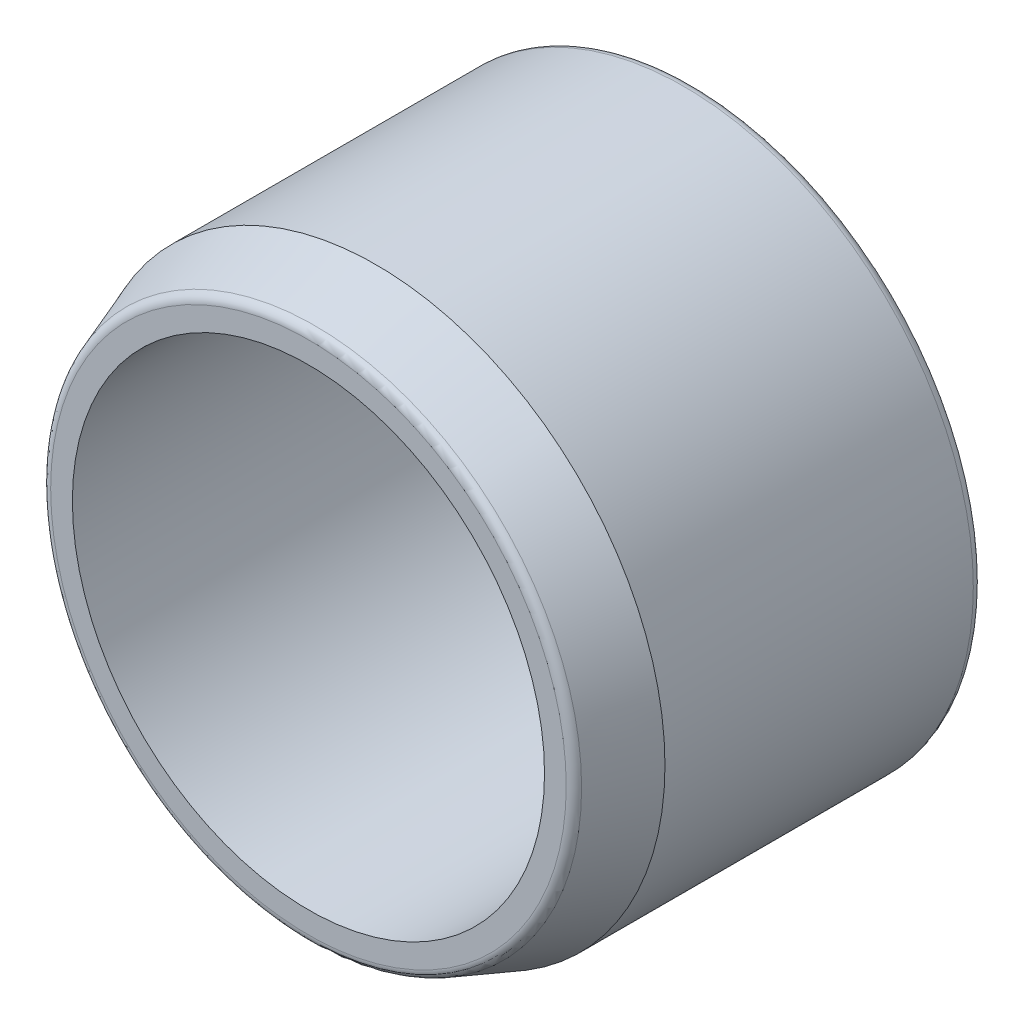
ISO-10303-21;
HEADER;
FILE_DESCRIPTION(('STEP AP214'),'2;1');
FILE_NAME('part.step','',(''),(''),'','','');
FILE_SCHEMA(('AUTOMOTIVE_DESIGN { 1 0 10303 214 1 1 1 1 }'));
ENDSEC;
DATA;
#1=APPLICATION_CONTEXT('core data for automotive mechanical design processes');
#2=APPLICATION_PROTOCOL_DEFINITION('international standard','automotive_design',2000,#1);
#3=PRODUCT_CONTEXT('',#1,'mechanical');
#4=PRODUCT('Part','Part','',(#3));
#5=PRODUCT_RELATED_PRODUCT_CATEGORY('part','',(#4));
#6=PRODUCT_DEFINITION_FORMATION('','',#4);
#7=PRODUCT_DEFINITION_CONTEXT('part definition',#1,'design');
#8=PRODUCT_DEFINITION('design','',#6,#7);
#9=PRODUCT_DEFINITION_SHAPE('','',#8);
#10=(LENGTH_UNIT() NAMED_UNIT(*) SI_UNIT(.MILLI.,.METRE.));
#11=(NAMED_UNIT(*) PLANE_ANGLE_UNIT() SI_UNIT($,.RADIAN.));
#12=(NAMED_UNIT(*) SI_UNIT($,.STERADIAN.) SOLID_ANGLE_UNIT());
#13=UNCERTAINTY_MEASURE_WITH_UNIT(LENGTH_MEASURE(1.E-05),#10,'distance_accuracy_value','');
#14=(GEOMETRIC_REPRESENTATION_CONTEXT(3) GLOBAL_UNCERTAINTY_ASSIGNED_CONTEXT((#13)) GLOBAL_UNIT_ASSIGNED_CONTEXT((#10,
#11,#12)) REPRESENTATION_CONTEXT('',''));
#15=CARTESIAN_POINT('',(0.,0.,0.));
#16=DIRECTION('',(0.,0.,1.));
#17=DIRECTION('',(1.,0.,0.));
#18=AXIS2_PLACEMENT_3D('',#15,#16,#17);
#19=CARTESIAN_POINT('',(0.,0.,40.));
#20=DIRECTION('',(0.,0.,1.));
#21=DIRECTION('',(1.,0.,0.));
#22=AXIS2_PLACEMENT_3D('',#19,#20,#21);
#23=PLANE('',#22);
#24=CARTESIAN_POINT('',(0.,0.,40.));
#25=DIRECTION('',(0.,0.,1.));
#26=DIRECTION('',(1.,0.,0.));
#27=AXIS2_PLACEMENT_3D('',#24,#25,#26);
#28=CIRCLE('',#27,26.7520008219269);
#29=CARTESIAN_POINT('',(26.7520008219269,0.,40.));
#30=VERTEX_POINT('',#29);
#31=EDGE_CURVE('E51',#30,#30,#28,.T.);
#32=ORIENTED_EDGE('',*,*,#31,.T.);
#33=EDGE_LOOP('',(#32));
#34=FACE_BOUND('',#33,.T.);
#35=CARTESIAN_POINT('',(0.,0.,40.));
#36=DIRECTION('',(0.,0.,1.));
#37=DIRECTION('',(1.,0.,0.));
#38=AXIS2_PLACEMENT_3D('',#35,#36,#37);
#39=CIRCLE('',#38,24.5);
#40=CARTESIAN_POINT('',(24.5,0.,40.));
#41=VERTEX_POINT('',#40);
#42=EDGE_CURVE('E71',#41,#41,#39,.T.);
#43=ORIENTED_EDGE('',*,*,#42,.F.);
#44=EDGE_LOOP('',(#43));
#45=FACE_BOUND('',#44,.T.);
#46=ADVANCED_FACE('F43',(#34,#45),#23,.T.);
#47=CARTESIAN_POINT('',(0.,0.,0.));
#48=DIRECTION('',(0.,0.,1.));
#49=DIRECTION('',(1.,0.,0.));
#50=AXIS2_PLACEMENT_3D('',#47,#48,#49);
#51=PLANE('',#50);
#52=CARTESIAN_POINT('',(0.,0.,0.));
#53=DIRECTION('',(0.,0.,1.));
#54=DIRECTION('',(1.,0.,0.));
#55=AXIS2_PLACEMENT_3D('',#52,#53,#54);
#56=CIRCLE('',#55,29.);
#57=CARTESIAN_POINT('',(29.,0.,0.));
#58=VERTEX_POINT('',#57);
#59=EDGE_CURVE('E56',#58,#58,#56,.F.);
#60=ORIENTED_EDGE('',*,*,#59,.T.);
#61=EDGE_LOOP('',(#60));
#62=FACE_BOUND('',#61,.T.);
#63=CARTESIAN_POINT('',(0.,0.,0.));
#64=DIRECTION('',(0.,0.,1.));
#65=DIRECTION('',(1.,0.,0.));
#66=AXIS2_PLACEMENT_3D('',#63,#64,#65);
#67=CIRCLE('',#66,24.5);
#68=CARTESIAN_POINT('',(24.5,0.,0.));
#69=VERTEX_POINT('',#68);
#70=EDGE_CURVE('E72',#69,#69,#67,.T.);
#71=ORIENTED_EDGE('',*,*,#70,.T.);
#72=EDGE_LOOP('',(#71));
#73=FACE_BOUND('',#72,.T.);
#74=ADVANCED_FACE('F84',(#62,#73),#51,.F.);
#75=CARTESIAN_POINT('',(0.,0.,40.));
#76=DIRECTION('',(0.,0.,-1.));
#77=DIRECTION('',(-1.,0.,0.));
#78=AXIS2_PLACEMENT_3D('',#75,#76,#77);
#79=CYLINDRICAL_SURFACE('',#78,30.);
#80=CARTESIAN_POINT('',(0.,0.,1.));
#81=DIRECTION('',(0.,0.,1.));
#82=DIRECTION('',(1.,0.,0.));
#83=AXIS2_PLACEMENT_3D('',#80,#81,#82);
#84=CIRCLE('',#83,30.);
#85=CARTESIAN_POINT('',(30.,0.,1.));
#86=VERTEX_POINT('',#85);
#87=EDGE_CURVE('E61',#86,#86,#84,.T.);
#88=ORIENTED_EDGE('',*,*,#87,.T.);
#89=EDGE_LOOP('',(#88));
#90=FACE_BOUND('',#89,.T.);
#91=CARTESIAN_POINT('',(0.,0.,32.9999999999999));
#92=DIRECTION('',(0.,0.,1.));
#93=DIRECTION('',(1.,0.,0.));
#94=AXIS2_PLACEMENT_3D('',#91,#92,#93);
#95=CIRCLE('',#94,30.);
#96=CARTESIAN_POINT('',(30.,0.,32.9999999999999));
#97=VERTEX_POINT('',#96);
#98=EDGE_CURVE('E67',#97,#97,#95,.F.);
#99=ORIENTED_EDGE('',*,*,#98,.T.);
#100=EDGE_LOOP('',(#99));
#101=FACE_BOUND('',#100,.T.);
#102=ADVANCED_FACE('F89',(#90,#101),#79,.T.);
#103=CARTESIAN_POINT('',(0.,0.,40.));
#104=DIRECTION('',(0.,0.,-1.));
#105=DIRECTION('',(-1.,0.,0.));
#106=AXIS2_PLACEMENT_3D('',#103,#104,#105);
#107=CYLINDRICAL_SURFACE('',#106,24.5);
#108=ORIENTED_EDGE('',*,*,#42,.T.);
#109=EDGE_LOOP('',(#108));
#110=FACE_BOUND('',#109,.T.);
#111=ORIENTED_EDGE('',*,*,#70,.F.);
#112=EDGE_LOOP('',(#111));
#113=FACE_BOUND('',#112,.T.);
#114=ADVANCED_FACE('F80',(#110,#113),#107,.F.);
#115=CARTESIAN_POINT('',(0.,0.,40.));
#116=DIRECTION('',(0.,0.,-1.));
#117=DIRECTION('',(-1.,0.,0.));
#118=AXIS2_PLACEMENT_3D('',#115,#116,#117);
#119=CONICAL_SURFACE('',#118,27.4522083601366,0.349065850398863);
#120=CARTESIAN_POINT('',(0.,0.,39.3420201433257));
#121=DIRECTION('',(0.,0.,1.));
#122=DIRECTION('',(1.,0.,0.));
#123=AXIS2_PLACEMENT_3D('',#120,#121,#122);
#124=CIRCLE('',#123,27.6916934427128);
#125=CARTESIAN_POINT('',(27.6916934427128,0.,39.3420201433257));
#126=VERTEX_POINT('',#125);
#127=EDGE_CURVE('E10',#126,#126,#124,.F.);
#128=ORIENTED_EDGE('',*,*,#127,.T.);
#129=EDGE_LOOP('',(#128));
#130=FACE_BOUND('',#129,.T.);
#131=ORIENTED_EDGE('',*,*,#98,.F.);
#132=EDGE_LOOP('',(#131));
#133=FACE_BOUND('',#132,.T.);
#134=ADVANCED_FACE('F98',(#130,#133),#119,.T.);
#135=CARTESIAN_POINT('',(0.,0.,1.));
#136=DIRECTION('',(0.,0.,1.));
#137=DIRECTION('',(1.,0.,0.));
#138=AXIS2_PLACEMENT_3D('',#135,#136,#137);
#139=TOROIDAL_SURFACE('',#138,29.,1.);
#140=ORIENTED_EDGE('',*,*,#59,.F.);
#141=EDGE_LOOP('',(#140));
#142=FACE_BOUND('',#141,.T.);
#143=ORIENTED_EDGE('',*,*,#87,.F.);
#144=EDGE_LOOP('',(#143));
#145=FACE_BOUND('',#144,.T.);
#146=ADVANCED_FACE('F102',(#142,#145),#139,.T.);
#147=CARTESIAN_POINT('',(0.,0.,39.));
#148=DIRECTION('',(0.,0.,1.));
#149=DIRECTION('',(1.,0.,0.));
#150=AXIS2_PLACEMENT_3D('',#147,#148,#149);
#151=TOROIDAL_SURFACE('',#150,26.7520008219269,1.);
#152=ORIENTED_EDGE('',*,*,#127,.F.);
#153=EDGE_LOOP('',(#152));
#154=FACE_BOUND('',#153,.T.);
#155=ORIENTED_EDGE('',*,*,#31,.F.);
#156=EDGE_LOOP('',(#155));
#157=FACE_BOUND('',#156,.T.);
#158=ADVANCED_FACE('F45',(#154,#157),#151,.T.);
#159=CLOSED_SHELL('',(#46,#74,#102,#114,#134,#146,#158));
#160=MANIFOLD_SOLID_BREP('B2',#159);
#161=ADVANCED_BREP_SHAPE_REPRESENTATION('',(#18,#160),#14);
#162=SHAPE_DEFINITION_REPRESENTATION(#9,#161);
ENDSEC;
END-ISO-10303-21;
